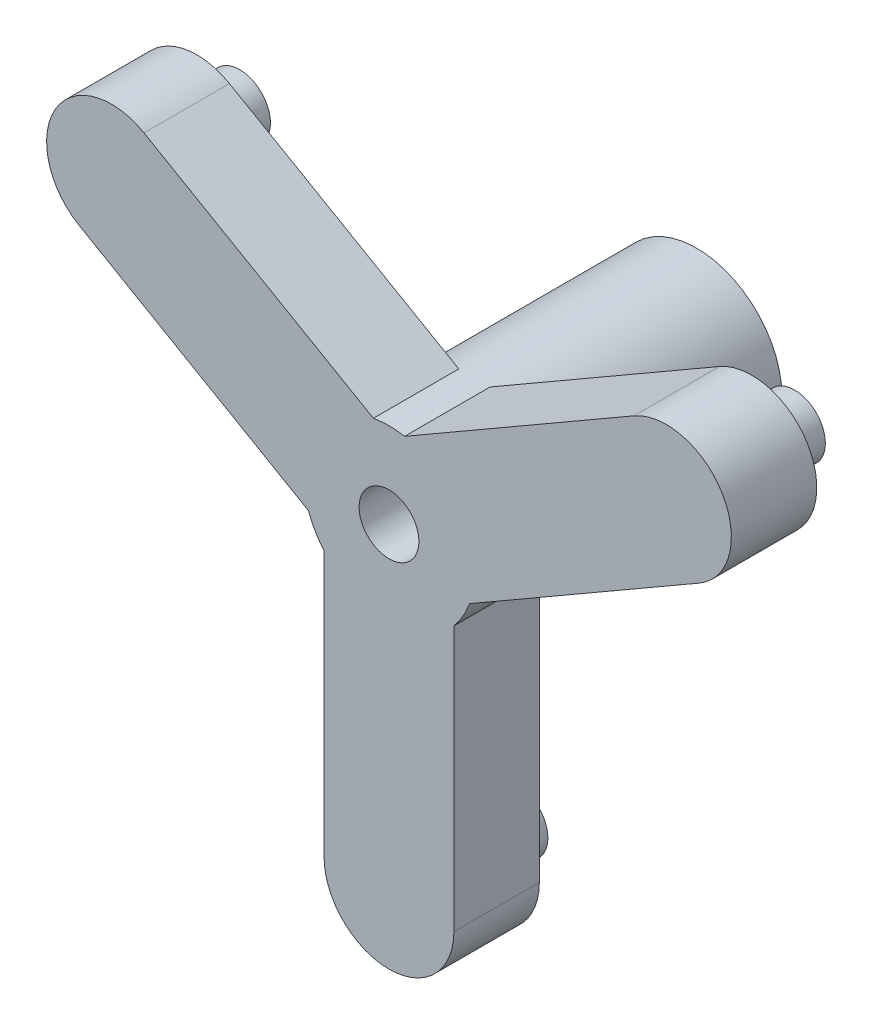
ISO-10303-21;
HEADER;
FILE_DESCRIPTION(('STEP AP214'),'2;1');
FILE_NAME('part.step','',(''),(''),'','','');
FILE_SCHEMA(('AUTOMOTIVE_DESIGN { 1 0 10303 214 1 1 1 1 }'));
ENDSEC;
DATA;
#1=APPLICATION_CONTEXT('core data for automotive mechanical design processes');
#2=APPLICATION_PROTOCOL_DEFINITION('international standard','automotive_design',2000,#1);
#3=PRODUCT_CONTEXT('',#1,'mechanical');
#4=PRODUCT('Part','Part','',(#3));
#5=PRODUCT_RELATED_PRODUCT_CATEGORY('part','',(#4));
#6=PRODUCT_DEFINITION_FORMATION('','',#4);
#7=PRODUCT_DEFINITION_CONTEXT('part definition',#1,'design');
#8=PRODUCT_DEFINITION('design','',#6,#7);
#9=PRODUCT_DEFINITION_SHAPE('','',#8);
#10=(LENGTH_UNIT() NAMED_UNIT(*) SI_UNIT(.MILLI.,.METRE.));
#11=(NAMED_UNIT(*) PLANE_ANGLE_UNIT() SI_UNIT($,.RADIAN.));
#12=(NAMED_UNIT(*) SI_UNIT($,.STERADIAN.) SOLID_ANGLE_UNIT());
#13=UNCERTAINTY_MEASURE_WITH_UNIT(LENGTH_MEASURE(1.E-05),#10,'distance_accuracy_value','');
#14=(GEOMETRIC_REPRESENTATION_CONTEXT(3) GLOBAL_UNCERTAINTY_ASSIGNED_CONTEXT((#13)) GLOBAL_UNIT_ASSIGNED_CONTEXT((#10,
#11,#12)) REPRESENTATION_CONTEXT('',''));
#15=CARTESIAN_POINT('',(0.,0.,0.));
#16=DIRECTION('',(0.,0.,1.));
#17=DIRECTION('',(1.,0.,0.));
#18=AXIS2_PLACEMENT_3D('',#15,#16,#17);
#19=CARTESIAN_POINT('',(0.,0.,16.51));
#20=DIRECTION('',(0.,0.,-1.));
#21=DIRECTION('',(-1.,0.,0.));
#22=AXIS2_PLACEMENT_3D('',#19,#20,#21);
#23=CYLINDRICAL_SURFACE('',#22,6.35);
#24=CARTESIAN_POINT('',(0.,0.,16.51));
#25=DIRECTION('',(0.,0.,1.));
#26=DIRECTION('',(1.,0.,0.));
#27=AXIS2_PLACEMENT_3D('',#24,#25,#26);
#28=CIRCLE('',#27,6.35);
#29=CARTESIAN_POINT('',(-1.16109680898544,6.24294435344124,16.51));
#30=VERTEX_POINT('',#29);
#31=CARTESIAN_POINT('',(-5.98709680898546,-2.11593284388615,16.51));
#32=VERTEX_POINT('',#31);
#33=EDGE_CURVE('E220',#30,#32,#28,.T.);
#34=ORIENTED_EDGE('',*,*,#33,.F.);
#35=DIRECTION('',(0.,0.,-1.));
#36=VECTOR('',#35,1.);
#37=CARTESIAN_POINT('',(-1.16109680898544,6.24294435344124,22.86));
#38=LINE('',#37,#36);
#39=CARTESIAN_POINT('',(-1.16109680898544,6.24294435344124,22.86));
#40=VERTEX_POINT('',#39);
#41=EDGE_CURVE('E193',#40,#30,#38,.T.);
#42=ORIENTED_EDGE('',*,*,#41,.F.);
#43=CARTESIAN_POINT('',(0.,0.,22.86));
#44=DIRECTION('',(0.,0.,1.));
#45=DIRECTION('',(1.,0.,0.));
#46=AXIS2_PLACEMENT_3D('',#43,#44,#45);
#47=CIRCLE('',#46,6.35);
#48=CARTESIAN_POINT('',(1.16109680898547,6.24294435344123,22.86));
#49=VERTEX_POINT('',#48);
#50=EDGE_CURVE('E148',#49,#40,#47,.T.);
#51=ORIENTED_EDGE('',*,*,#50,.F.);
#52=DIRECTION('',(0.,0.,-1.));
#53=VECTOR('',#52,1.);
#54=CARTESIAN_POINT('',(1.16109680898547,6.24294435344123,22.86));
#55=LINE('',#54,#53);
#56=CARTESIAN_POINT('',(1.16109680898547,6.24294435344123,16.51));
#57=VERTEX_POINT('',#56);
#58=EDGE_CURVE('E195',#49,#57,#55,.T.);
#59=ORIENTED_EDGE('',*,*,#58,.T.);
#60=CARTESIAN_POINT('',(5.98709680898545,-2.11593284388617,16.51));
#61=VERTEX_POINT('',#60);
#62=EDGE_CURVE('E49',#61,#57,#28,.T.);
#63=ORIENTED_EDGE('',*,*,#62,.F.);
#64=DIRECTION('',(0.,0.,-1.));
#65=VECTOR('',#64,1.);
#66=CARTESIAN_POINT('',(5.98709680898545,-2.11593284388617,22.86));
#67=LINE('',#66,#65);
#68=CARTESIAN_POINT('',(5.98709680898545,-2.11593284388617,22.86));
#69=VERTEX_POINT('',#68);
#70=EDGE_CURVE('E202',#69,#61,#67,.T.);
#71=ORIENTED_EDGE('',*,*,#70,.F.);
#72=CARTESIAN_POINT('',(4.826,-4.12701150955507,22.86));
#73=VERTEX_POINT('',#72);
#74=EDGE_CURVE('E163',#73,#69,#47,.T.);
#75=ORIENTED_EDGE('',*,*,#74,.F.);
#76=DIRECTION('',(0.,0.,-1.));
#77=VECTOR('',#76,1.);
#78=CARTESIAN_POINT('',(4.826,-4.12701150955507,22.86));
#79=LINE('',#78,#77);
#80=CARTESIAN_POINT('',(4.826,-4.12701150955507,16.51));
#81=VERTEX_POINT('',#80);
#82=EDGE_CURVE('E204',#73,#81,#79,.T.);
#83=ORIENTED_EDGE('',*,*,#82,.T.);
#84=CARTESIAN_POINT('',(-4.826,-4.12701150955507,16.51));
#85=VERTEX_POINT('',#84);
#86=EDGE_CURVE('E57',#85,#81,#28,.T.);
#87=ORIENTED_EDGE('',*,*,#86,.F.);
#88=DIRECTION('',(0.,0.,-1.));
#89=VECTOR('',#88,1.);
#90=CARTESIAN_POINT('',(-4.826,-4.12701150955507,22.86));
#91=LINE('',#90,#89);
#92=CARTESIAN_POINT('',(-4.826,-4.12701150955507,22.86));
#93=VERTEX_POINT('',#92);
#94=EDGE_CURVE('E212',#93,#85,#91,.T.);
#95=ORIENTED_EDGE('',*,*,#94,.F.);
#96=CARTESIAN_POINT('',(-5.98709680898546,-2.11593284388615,22.86));
#97=VERTEX_POINT('',#96);
#98=EDGE_CURVE('E160',#97,#93,#47,.T.);
#99=ORIENTED_EDGE('',*,*,#98,.F.);
#100=DIRECTION('',(0.,0.,-1.));
#101=VECTOR('',#100,1.);
#102=CARTESIAN_POINT('',(-5.98709680898546,-2.11593284388615,22.86));
#103=LINE('',#102,#101);
#104=EDGE_CURVE('E215',#97,#32,#103,.T.);
#105=ORIENTED_EDGE('',*,*,#104,.T.);
#106=EDGE_LOOP('',(#34,#42,#51,#59,#63,#71,#75,#83,#87,#95,#99,#105));
#107=FACE_BOUND('',#106,.T.);
#108=CARTESIAN_POINT('',(0.,0.,0.));
#109=DIRECTION('',(0.,0.,1.));
#110=DIRECTION('',(1.,0.,0.));
#111=AXIS2_PLACEMENT_3D('',#108,#109,#110);
#112=CIRCLE('',#111,6.35);
#113=CARTESIAN_POINT('',(6.35,0.,0.));
#114=VERTEX_POINT('',#113);
#115=EDGE_CURVE('E135',#114,#114,#112,.T.);
#116=ORIENTED_EDGE('',*,*,#115,.T.);
#117=EDGE_LOOP('',(#116));
#118=FACE_BOUND('',#117,.T.);
#119=ADVANCED_FACE('F35',(#107,#118),#23,.T.);
#120=CARTESIAN_POINT('',(0.,0.,0.));
#121=DIRECTION('',(0.,0.,1.));
#122=DIRECTION('',(1.,0.,0.));
#123=AXIS2_PLACEMENT_3D('',#120,#121,#122);
#124=PLANE('',#123);
#125=CARTESIAN_POINT('',(0.,0.,0.));
#126=DIRECTION('',(0.,0.,-1.));
#127=DIRECTION('',(-1.,0.,0.));
#128=AXIS2_PLACEMENT_3D('',#125,#126,#127);
#129=CIRCLE('',#128,2.2225);
#130=CARTESIAN_POINT('',(-2.2225,0.,0.));
#131=VERTEX_POINT('',#130);
#132=EDGE_CURVE('E467',#131,#131,#129,.T.);
#133=ORIENTED_EDGE('',*,*,#132,.F.);
#134=EDGE_LOOP('',(#133));
#135=FACE_BOUND('',#134,.T.);
#136=ORIENTED_EDGE('',*,*,#115,.F.);
#137=EDGE_LOOP('',(#136));
#138=FACE_BOUND('',#137,.T.);
#139=ADVANCED_FACE('F274',(#135,#138),#124,.F.);
#140=CARTESIAN_POINT('',(0.,0.,16.51));
#141=DIRECTION('',(0.,0.,1.));
#142=DIRECTION('',(1.,0.,0.));
#143=AXIS2_PLACEMENT_3D('',#140,#141,#142);
#144=PLANE('',#143);
#145=CARTESIAN_POINT('',(-20.6222299276171,11.9062499999998,16.51));
#146=DIRECTION('',(0.,0.,1.));
#147=DIRECTION('',(1.,0.,0.));
#148=AXIS2_PLACEMENT_3D('',#145,#146,#147);
#149=CIRCLE('',#148,2.286);
#150=CARTESIAN_POINT('',(-18.3362299276171,11.9062499999998,16.51));
#151=VERTEX_POINT('',#150);
#152=EDGE_CURVE('E11',#151,#151,#149,.F.);
#153=ORIENTED_EDGE('',*,*,#152,.F.);
#154=EDGE_LOOP('',(#153));
#155=FACE_BOUND('',#154,.T.);
#156=DIRECTION('',(0.866025403784438,-0.5,0.));
#157=VECTOR('',#156,1.);
#158=CARTESIAN_POINT('',(2.413,4.1794385986637,16.51));
#159=LINE('',#158,#157);
#160=CARTESIAN_POINT('',(-18.2092299276169,16.0856885986637,16.51));
#161=VERTEX_POINT('',#160);
#162=EDGE_CURVE('E132',#161,#30,#159,.T.);
#163=ORIENTED_EDGE('',*,*,#162,.T.);
#164=ORIENTED_EDGE('',*,*,#33,.T.);
#165=DIRECTION('',(0.866025403784439,-0.5,0.));
#166=VECTOR('',#165,1.);
#167=CARTESIAN_POINT('',(-2.41299999999999,-4.17943859866369,16.51));
#168=LINE('',#167,#166);
#169=CARTESIAN_POINT('',(-23.0352299276169,7.72681140133631,16.51));
#170=VERTEX_POINT('',#169);
#171=EDGE_CURVE('E180',#170,#32,#168,.T.);
#172=ORIENTED_EDGE('',*,*,#171,.F.);
#173=CARTESIAN_POINT('',(-20.6222299276169,11.90625,16.51));
#174=DIRECTION('',(0.,0.,1.));
#175=DIRECTION('',(1.,0.,0.));
#176=AXIS2_PLACEMENT_3D('',#173,#174,#175);
#177=CIRCLE('',#176,4.826);
#178=EDGE_CURVE('E178',#161,#170,#177,.T.);
#179=ORIENTED_EDGE('',*,*,#178,.F.);
#180=EDGE_LOOP('',(#163,#164,#172,#179));
#181=FACE_BOUND('',#180,.T.);
#182=ADVANCED_FACE('F235',(#155,#181),#144,.F.);
#183=CARTESIAN_POINT('',(0.,-23.8125,16.51));
#184=DIRECTION('',(0.,0.,1.));
#185=DIRECTION('',(1.,0.,0.));
#186=AXIS2_PLACEMENT_3D('',#183,#184,#185);
#187=CIRCLE('',#186,2.286);
#188=CARTESIAN_POINT('',(2.286,-23.8125,16.51));
#189=VERTEX_POINT('',#188);
#190=EDGE_CURVE('E223',#189,#189,#187,.F.);
#191=ORIENTED_EDGE('',*,*,#190,.F.);
#192=EDGE_LOOP('',(#191));
#193=FACE_BOUND('',#192,.T.);
#194=DIRECTION('',(0.,1.,0.));
#195=VECTOR('',#194,1.);
#196=CARTESIAN_POINT('',(-4.826,0.,16.51));
#197=LINE('',#196,#195);
#198=CARTESIAN_POINT('',(-4.826,-23.8125,16.51));
#199=VERTEX_POINT('',#198);
#200=EDGE_CURVE('E183',#199,#85,#197,.T.);
#201=ORIENTED_EDGE('',*,*,#200,.T.);
#202=ORIENTED_EDGE('',*,*,#86,.T.);
#203=DIRECTION('',(0.,1.,0.));
#204=VECTOR('',#203,1.);
#205=CARTESIAN_POINT('',(4.826,0.,16.51));
#206=LINE('',#205,#204);
#207=CARTESIAN_POINT('',(4.826,-23.8125,16.51));
#208=VERTEX_POINT('',#207);
#209=EDGE_CURVE('E187',#208,#81,#206,.T.);
#210=ORIENTED_EDGE('',*,*,#209,.F.);
#211=CARTESIAN_POINT('',(0.,-23.8125,16.51));
#212=DIRECTION('',(0.,0.,1.));
#213=DIRECTION('',(1.,0.,0.));
#214=AXIS2_PLACEMENT_3D('',#211,#212,#213);
#215=CIRCLE('',#214,4.826);
#216=EDGE_CURVE('E185',#199,#208,#215,.T.);
#217=ORIENTED_EDGE('',*,*,#216,.F.);
#218=EDGE_LOOP('',(#201,#202,#210,#217));
#219=FACE_BOUND('',#218,.T.);
#220=ADVANCED_FACE('F233',(#193,#219),#144,.F.);
#221=CARTESIAN_POINT('',(20.6222299276169,11.9062500000001,16.51));
#222=DIRECTION('',(0.,0.,1.));
#223=DIRECTION('',(1.,0.,0.));
#224=AXIS2_PLACEMENT_3D('',#221,#222,#223);
#225=CIRCLE('',#224,2.286);
#226=CARTESIAN_POINT('',(22.9082299276169,11.9062500000001,16.51));
#227=VERTEX_POINT('',#226);
#228=EDGE_CURVE('E42',#227,#227,#225,.F.);
#229=ORIENTED_EDGE('',*,*,#228,.F.);
#230=EDGE_LOOP('',(#229));
#231=FACE_BOUND('',#230,.T.);
#232=DIRECTION('',(-0.866025403784439,-0.5,0.));
#233=VECTOR('',#232,1.);
#234=CARTESIAN_POINT('',(2.413,-4.1794385986637,16.51));
#235=LINE('',#234,#233);
#236=CARTESIAN_POINT('',(23.035229927617,7.7268114013363,16.51));
#237=VERTEX_POINT('',#236);
#238=EDGE_CURVE('E189',#237,#61,#235,.T.);
#239=ORIENTED_EDGE('',*,*,#238,.T.);
#240=ORIENTED_EDGE('',*,*,#62,.T.);
#241=DIRECTION('',(-0.866025403784438,-0.5,0.));
#242=VECTOR('',#241,1.);
#243=CARTESIAN_POINT('',(-2.41299999999999,4.17943859866369,16.51));
#244=LINE('',#243,#242);
#245=CARTESIAN_POINT('',(18.209229927617,16.0856885986637,16.51));
#246=VERTEX_POINT('',#245);
#247=EDGE_CURVE('E150',#246,#57,#244,.T.);
#248=ORIENTED_EDGE('',*,*,#247,.F.);
#249=CARTESIAN_POINT('',(20.6222299276169,11.90625,16.51));
#250=DIRECTION('',(0.,0.,1.));
#251=DIRECTION('',(1.,0.,0.));
#252=AXIS2_PLACEMENT_3D('',#249,#250,#251);
#253=CIRCLE('',#252,4.826);
#254=EDGE_CURVE('E153',#237,#246,#253,.T.);
#255=ORIENTED_EDGE('',*,*,#254,.F.);
#256=EDGE_LOOP('',(#239,#240,#248,#255));
#257=FACE_BOUND('',#256,.T.);
#258=ADVANCED_FACE('F230',(#231,#257),#144,.F.);
#259=CARTESIAN_POINT('',(2.413,4.1794385986637,22.86));
#260=DIRECTION('',(0.5,0.866025403784438,0.));
#261=DIRECTION('',(-0.866025403784438,0.5,0.));
#262=AXIS2_PLACEMENT_3D('',#259,#260,#261);
#263=PLANE('',#262);
#264=ORIENTED_EDGE('',*,*,#162,.F.);
#265=DIRECTION('',(0.,0.,-1.));
#266=VECTOR('',#265,1.);
#267=CARTESIAN_POINT('',(-18.2092299276169,16.0856885986637,22.86));
#268=LINE('',#267,#266);
#269=CARTESIAN_POINT('',(-18.2092299276169,16.0856885986637,22.86));
#270=VERTEX_POINT('',#269);
#271=EDGE_CURVE('E125',#270,#161,#268,.T.);
#272=ORIENTED_EDGE('',*,*,#271,.F.);
#273=DIRECTION('',(0.866025403784438,-0.5,0.));
#274=VECTOR('',#273,1.);
#275=CARTESIAN_POINT('',(2.413,4.1794385986637,22.86));
#276=LINE('',#275,#274);
#277=EDGE_CURVE('E130',#270,#40,#276,.T.);
#278=ORIENTED_EDGE('',*,*,#277,.T.);
#279=ORIENTED_EDGE('',*,*,#41,.T.);
#280=EDGE_LOOP('',(#264,#272,#278,#279));
#281=FACE_BOUND('',#280,.T.);
#282=ADVANCED_FACE('F127',(#281),#263,.T.);
#283=CARTESIAN_POINT('',(-20.6222299276169,11.90625,22.86));
#284=DIRECTION('',(0.,0.,-1.));
#285=DIRECTION('',(-1.,0.,0.));
#286=AXIS2_PLACEMENT_3D('',#283,#284,#285);
#287=CYLINDRICAL_SURFACE('',#286,4.826);
#288=ORIENTED_EDGE('',*,*,#178,.T.);
#289=DIRECTION('',(0.,0.,-1.));
#290=VECTOR('',#289,1.);
#291=CARTESIAN_POINT('',(-23.0352299276169,7.72681140133631,22.86));
#292=LINE('',#291,#290);
#293=CARTESIAN_POINT('',(-23.0352299276169,7.72681140133631,22.86));
#294=VERTEX_POINT('',#293);
#295=EDGE_CURVE('E136',#294,#170,#292,.T.);
#296=ORIENTED_EDGE('',*,*,#295,.F.);
#297=CARTESIAN_POINT('',(-20.6222299276169,11.90625,22.86));
#298=DIRECTION('',(0.,0.,1.));
#299=DIRECTION('',(1.,0.,0.));
#300=AXIS2_PLACEMENT_3D('',#297,#298,#299);
#301=CIRCLE('',#300,4.826);
#302=EDGE_CURVE('E139',#270,#294,#301,.T.);
#303=ORIENTED_EDGE('',*,*,#302,.F.);
#304=ORIENTED_EDGE('',*,*,#271,.T.);
#305=EDGE_LOOP('',(#288,#296,#303,#304));
#306=FACE_BOUND('',#305,.T.);
#307=ADVANCED_FACE('F140',(#306),#287,.T.);
#308=CARTESIAN_POINT('',(-2.41299999999999,-4.17943859866369,22.86));
#309=DIRECTION('',(0.5,0.866025403784439,0.));
#310=DIRECTION('',(-0.866025403784439,0.5,0.));
#311=AXIS2_PLACEMENT_3D('',#308,#309,#310);
#312=PLANE('',#311);
#313=ORIENTED_EDGE('',*,*,#171,.T.);
#314=ORIENTED_EDGE('',*,*,#104,.F.);
#315=DIRECTION('',(0.866025403784439,-0.5,0.));
#316=VECTOR('',#315,1.);
#317=CARTESIAN_POINT('',(-2.41299999999999,-4.17943859866369,22.86));
#318=LINE('',#317,#316);
#319=EDGE_CURVE('E144',#294,#97,#318,.T.);
#320=ORIENTED_EDGE('',*,*,#319,.F.);
#321=ORIENTED_EDGE('',*,*,#295,.T.);
#322=EDGE_LOOP('',(#313,#314,#320,#321));
#323=FACE_BOUND('',#322,.T.);
#324=ADVANCED_FACE('F263',(#323),#312,.F.);
#325=CARTESIAN_POINT('',(-4.826,0.,22.86));
#326=DIRECTION('',(-1.,0.,0.));
#327=DIRECTION('',(0.,-1.,0.));
#328=AXIS2_PLACEMENT_3D('',#325,#326,#327);
#329=PLANE('',#328);
#330=ORIENTED_EDGE('',*,*,#200,.F.);
#331=DIRECTION('',(0.,0.,-1.));
#332=VECTOR('',#331,1.);
#333=CARTESIAN_POINT('',(-4.826,-23.8125,22.86));
#334=LINE('',#333,#332);
#335=CARTESIAN_POINT('',(-4.826,-23.8125,22.86));
#336=VERTEX_POINT('',#335);
#337=EDGE_CURVE('E210',#336,#199,#334,.T.);
#338=ORIENTED_EDGE('',*,*,#337,.F.);
#339=DIRECTION('',(0.,1.,0.));
#340=VECTOR('',#339,1.);
#341=CARTESIAN_POINT('',(-4.826,0.,22.86));
#342=LINE('',#341,#340);
#343=EDGE_CURVE('E162',#336,#93,#342,.T.);
#344=ORIENTED_EDGE('',*,*,#343,.T.);
#345=ORIENTED_EDGE('',*,*,#94,.T.);
#346=EDGE_LOOP('',(#330,#338,#344,#345));
#347=FACE_BOUND('',#346,.T.);
#348=ADVANCED_FACE('F256',(#347),#329,.T.);
#349=CARTESIAN_POINT('',(0.,-23.8125,22.86));
#350=DIRECTION('',(0.,0.,-1.));
#351=DIRECTION('',(-1.,0.,0.));
#352=AXIS2_PLACEMENT_3D('',#349,#350,#351);
#353=CYLINDRICAL_SURFACE('',#352,4.826);
#354=ORIENTED_EDGE('',*,*,#216,.T.);
#355=DIRECTION('',(0.,0.,-1.));
#356=VECTOR('',#355,1.);
#357=CARTESIAN_POINT('',(4.826,-23.8125,22.86));
#358=LINE('',#357,#356);
#359=CARTESIAN_POINT('',(4.826,-23.8125,22.86));
#360=VERTEX_POINT('',#359);
#361=EDGE_CURVE('E207',#360,#208,#358,.T.);
#362=ORIENTED_EDGE('',*,*,#361,.F.);
#363=CARTESIAN_POINT('',(0.,-23.8125,22.86));
#364=DIRECTION('',(0.,0.,1.));
#365=DIRECTION('',(1.,0.,0.));
#366=AXIS2_PLACEMENT_3D('',#363,#364,#365);
#367=CIRCLE('',#366,4.826);
#368=EDGE_CURVE('E166',#336,#360,#367,.T.);
#369=ORIENTED_EDGE('',*,*,#368,.F.);
#370=ORIENTED_EDGE('',*,*,#337,.T.);
#371=EDGE_LOOP('',(#354,#362,#369,#370));
#372=FACE_BOUND('',#371,.T.);
#373=ADVANCED_FACE('F270',(#372),#353,.T.);
#374=CARTESIAN_POINT('',(4.826,0.,22.86));
#375=DIRECTION('',(-1.,0.,0.));
#376=DIRECTION('',(0.,-1.,0.));
#377=AXIS2_PLACEMENT_3D('',#374,#375,#376);
#378=PLANE('',#377);
#379=ORIENTED_EDGE('',*,*,#209,.T.);
#380=ORIENTED_EDGE('',*,*,#82,.F.);
#381=DIRECTION('',(0.,1.,0.));
#382=VECTOR('',#381,1.);
#383=CARTESIAN_POINT('',(4.826,0.,22.86));
#384=LINE('',#383,#382);
#385=EDGE_CURVE('E168',#360,#73,#384,.T.);
#386=ORIENTED_EDGE('',*,*,#385,.F.);
#387=ORIENTED_EDGE('',*,*,#361,.T.);
#388=EDGE_LOOP('',(#379,#380,#386,#387));
#389=FACE_BOUND('',#388,.T.);
#390=ADVANCED_FACE('F251',(#389),#378,.F.);
#391=CARTESIAN_POINT('',(2.413,-4.1794385986637,22.86));
#392=DIRECTION('',(0.5,-0.866025403784439,0.));
#393=DIRECTION('',(0.866025403784439,0.5,0.));
#394=AXIS2_PLACEMENT_3D('',#391,#392,#393);
#395=PLANE('',#394);
#396=ORIENTED_EDGE('',*,*,#238,.F.);
#397=DIRECTION('',(0.,0.,-1.));
#398=VECTOR('',#397,1.);
#399=CARTESIAN_POINT('',(23.035229927617,7.7268114013363,22.86));
#400=LINE('',#399,#398);
#401=CARTESIAN_POINT('',(23.035229927617,7.7268114013363,22.86));
#402=VERTEX_POINT('',#401);
#403=EDGE_CURVE('E200',#402,#237,#400,.T.);
#404=ORIENTED_EDGE('',*,*,#403,.F.);
#405=DIRECTION('',(-0.866025403784439,-0.5,0.));
#406=VECTOR('',#405,1.);
#407=CARTESIAN_POINT('',(2.413,-4.1794385986637,22.86));
#408=LINE('',#407,#406);
#409=EDGE_CURVE('E170',#402,#69,#408,.T.);
#410=ORIENTED_EDGE('',*,*,#409,.T.);
#411=ORIENTED_EDGE('',*,*,#70,.T.);
#412=EDGE_LOOP('',(#396,#404,#410,#411));
#413=FACE_BOUND('',#412,.T.);
#414=ADVANCED_FACE('F240',(#413),#395,.T.);
#415=CARTESIAN_POINT('',(20.6222299276169,11.90625,22.86));
#416=DIRECTION('',(0.,0.,-1.));
#417=DIRECTION('',(-1.,0.,0.));
#418=AXIS2_PLACEMENT_3D('',#415,#416,#417);
#419=CYLINDRICAL_SURFACE('',#418,4.826);
#420=ORIENTED_EDGE('',*,*,#254,.T.);
#421=DIRECTION('',(0.,0.,-1.));
#422=VECTOR('',#421,1.);
#423=CARTESIAN_POINT('',(18.209229927617,16.0856885986637,22.86));
#424=LINE('',#423,#422);
#425=CARTESIAN_POINT('',(18.209229927617,16.0856885986637,22.86));
#426=VERTEX_POINT('',#425);
#427=EDGE_CURVE('E197',#426,#246,#424,.T.);
#428=ORIENTED_EDGE('',*,*,#427,.F.);
#429=CARTESIAN_POINT('',(20.6222299276169,11.90625,22.86));
#430=DIRECTION('',(0.,0.,1.));
#431=DIRECTION('',(1.,0.,0.));
#432=AXIS2_PLACEMENT_3D('',#429,#430,#431);
#433=CIRCLE('',#432,4.826);
#434=EDGE_CURVE('E173',#402,#426,#433,.T.);
#435=ORIENTED_EDGE('',*,*,#434,.F.);
#436=ORIENTED_EDGE('',*,*,#403,.T.);
#437=EDGE_LOOP('',(#420,#428,#435,#436));
#438=FACE_BOUND('',#437,.T.);
#439=ADVANCED_FACE('F331',(#438),#419,.T.);
#440=CARTESIAN_POINT('',(-2.41299999999999,4.17943859866369,22.86));
#441=DIRECTION('',(0.5,-0.866025403784438,0.));
#442=DIRECTION('',(0.866025403784438,0.5,0.));
#443=AXIS2_PLACEMENT_3D('',#440,#441,#442);
#444=PLANE('',#443);
#445=ORIENTED_EDGE('',*,*,#247,.T.);
#446=ORIENTED_EDGE('',*,*,#58,.F.);
#447=DIRECTION('',(-0.866025403784438,-0.5,0.));
#448=VECTOR('',#447,1.);
#449=CARTESIAN_POINT('',(-2.41299999999999,4.17943859866369,22.86));
#450=LINE('',#449,#448);
#451=EDGE_CURVE('E175',#426,#49,#450,.T.);
#452=ORIENTED_EDGE('',*,*,#451,.F.);
#453=ORIENTED_EDGE('',*,*,#427,.T.);
#454=EDGE_LOOP('',(#445,#446,#452,#453));
#455=FACE_BOUND('',#454,.T.);
#456=ADVANCED_FACE('F340',(#455),#444,.F.);
#457=CARTESIAN_POINT('',(0.,0.,22.86));
#458=DIRECTION('',(0.,0.,1.));
#459=DIRECTION('',(1.,0.,0.));
#460=AXIS2_PLACEMENT_3D('',#457,#458,#459);
#461=PLANE('',#460);
#462=CARTESIAN_POINT('',(0.,0.,22.86));
#463=DIRECTION('',(0.,0.,-1.));
#464=DIRECTION('',(-1.,0.,0.));
#465=AXIS2_PLACEMENT_3D('',#462,#463,#464);
#466=CIRCLE('',#465,2.2225);
#467=CARTESIAN_POINT('',(-2.2225,0.,22.86));
#468=VERTEX_POINT('',#467);
#469=EDGE_CURVE('E465',#468,#468,#466,.T.);
#470=ORIENTED_EDGE('',*,*,#469,.T.);
#471=EDGE_LOOP('',(#470));
#472=FACE_BOUND('',#471,.T.);
#473=ORIENTED_EDGE('',*,*,#277,.F.);
#474=ORIENTED_EDGE('',*,*,#302,.T.);
#475=ORIENTED_EDGE('',*,*,#319,.T.);
#476=ORIENTED_EDGE('',*,*,#98,.T.);
#477=ORIENTED_EDGE('',*,*,#343,.F.);
#478=ORIENTED_EDGE('',*,*,#368,.T.);
#479=ORIENTED_EDGE('',*,*,#385,.T.);
#480=ORIENTED_EDGE('',*,*,#74,.T.);
#481=ORIENTED_EDGE('',*,*,#409,.F.);
#482=ORIENTED_EDGE('',*,*,#434,.T.);
#483=ORIENTED_EDGE('',*,*,#451,.T.);
#484=ORIENTED_EDGE('',*,*,#50,.T.);
#485=EDGE_LOOP('',(#473,#474,#475,#476,#477,#478,#479,#480,#481,#482,#483,#484));
#486=FACE_BOUND('',#485,.T.);
#487=ADVANCED_FACE('F146',(#472,#486),#461,.T.);
#488=CARTESIAN_POINT('',(0.,-23.8125,13.335));
#489=DIRECTION('',(0.,0.,1.));
#490=DIRECTION('',(1.,0.,0.));
#491=AXIS2_PLACEMENT_3D('',#488,#489,#490);
#492=CYLINDRICAL_SURFACE('',#491,2.286);
#493=CARTESIAN_POINT('',(0.,-23.8125,13.335));
#494=DIRECTION('',(0.,0.,-1.));
#495=DIRECTION('',(-1.,0.,0.));
#496=AXIS2_PLACEMENT_3D('',#493,#494,#495);
#497=CIRCLE('',#496,2.286);
#498=CARTESIAN_POINT('',(-2.286,-23.8125,13.335));
#499=VERTEX_POINT('',#498);
#500=EDGE_CURVE('E156',#499,#499,#497,.T.);
#501=ORIENTED_EDGE('',*,*,#500,.F.);
#502=EDGE_LOOP('',(#501));
#503=FACE_BOUND('',#502,.T.);
#504=ORIENTED_EDGE('',*,*,#190,.T.);
#505=EDGE_LOOP('',(#504));
#506=FACE_BOUND('',#505,.T.);
#507=ADVANCED_FACE('F379',(#503,#506),#492,.T.);
#508=CARTESIAN_POINT('',(0.,-23.8125,13.335));
#509=DIRECTION('',(0.,0.,-1.));
#510=DIRECTION('',(-1.,0.,0.));
#511=AXIS2_PLACEMENT_3D('',#508,#509,#510);
#512=PLANE('',#511);
#513=ORIENTED_EDGE('',*,*,#500,.T.);
#514=EDGE_LOOP('',(#513));
#515=FACE_BOUND('',#514,.T.);
#516=ADVANCED_FACE('F384',(#515),#512,.T.);
#517=CARTESIAN_POINT('',(20.6222299276169,11.9062500000001,13.335));
#518=DIRECTION('',(0.,0.,1.));
#519=DIRECTION('',(1.,0.,0.));
#520=AXIS2_PLACEMENT_3D('',#517,#518,#519);
#521=CYLINDRICAL_SURFACE('',#520,2.286);
#522=CARTESIAN_POINT('',(20.6222299276169,11.9062500000001,13.335));
#523=DIRECTION('',(0.,0.,-1.));
#524=DIRECTION('',(-1.,0.,0.));
#525=AXIS2_PLACEMENT_3D('',#522,#523,#524);
#526=CIRCLE('',#525,2.286);
#527=CARTESIAN_POINT('',(18.3362299276169,11.9062500000001,13.335));
#528=VERTEX_POINT('',#527);
#529=EDGE_CURVE('E473',#528,#528,#526,.T.);
#530=ORIENTED_EDGE('',*,*,#529,.F.);
#531=EDGE_LOOP('',(#530));
#532=FACE_BOUND('',#531,.T.);
#533=ORIENTED_EDGE('',*,*,#228,.T.);
#534=EDGE_LOOP('',(#533));
#535=FACE_BOUND('',#534,.T.);
#536=ADVANCED_FACE('F228',(#532,#535),#521,.T.);
#537=CARTESIAN_POINT('',(20.6222299276169,11.9062500000001,13.335));
#538=DIRECTION('',(0.,0.,-1.));
#539=DIRECTION('',(-1.,0.,0.));
#540=AXIS2_PLACEMENT_3D('',#537,#538,#539);
#541=PLANE('',#540);
#542=ORIENTED_EDGE('',*,*,#529,.T.);
#543=EDGE_LOOP('',(#542));
#544=FACE_BOUND('',#543,.T.);
#545=ADVANCED_FACE('F404',(#544),#541,.T.);
#546=CARTESIAN_POINT('',(-20.6222299276171,11.9062499999998,13.335));
#547=DIRECTION('',(0.,0.,1.));
#548=DIRECTION('',(1.,0.,0.));
#549=AXIS2_PLACEMENT_3D('',#546,#547,#548);
#550=CYLINDRICAL_SURFACE('',#549,2.286);
#551=CARTESIAN_POINT('',(-20.6222299276171,11.9062499999998,13.335));
#552=DIRECTION('',(0.,0.,-1.));
#553=DIRECTION('',(-1.,0.,0.));
#554=AXIS2_PLACEMENT_3D('',#551,#552,#553);
#555=CIRCLE('',#554,2.286);
#556=CARTESIAN_POINT('',(-22.9082299276171,11.9062499999998,13.335));
#557=VERTEX_POINT('',#556);
#558=EDGE_CURVE('E469',#557,#557,#555,.T.);
#559=ORIENTED_EDGE('',*,*,#558,.F.);
#560=EDGE_LOOP('',(#559));
#561=FACE_BOUND('',#560,.T.);
#562=ORIENTED_EDGE('',*,*,#152,.T.);
#563=EDGE_LOOP('',(#562));
#564=FACE_BOUND('',#563,.T.);
#565=ADVANCED_FACE('F414',(#561,#564),#550,.T.);
#566=CARTESIAN_POINT('',(-20.6222299276171,11.9062499999998,13.335));
#567=DIRECTION('',(0.,0.,-1.));
#568=DIRECTION('',(-1.,0.,0.));
#569=AXIS2_PLACEMENT_3D('',#566,#567,#568);
#570=PLANE('',#569);
#571=ORIENTED_EDGE('',*,*,#558,.T.);
#572=EDGE_LOOP('',(#571));
#573=FACE_BOUND('',#572,.T.);
#574=ADVANCED_FACE('F424',(#573),#570,.T.);
#575=CARTESIAN_POINT('',(0.,0.,22.86));
#576=DIRECTION('',(0.,0.,-1.));
#577=DIRECTION('',(-1.,0.,0.));
#578=AXIS2_PLACEMENT_3D('',#575,#576,#577);
#579=CYLINDRICAL_SURFACE('',#578,2.2225);
#580=ORIENTED_EDGE('',*,*,#469,.F.);
#581=EDGE_LOOP('',(#580));
#582=FACE_BOUND('',#581,.T.);
#583=ORIENTED_EDGE('',*,*,#132,.T.);
#584=EDGE_LOOP('',(#583));
#585=FACE_BOUND('',#584,.T.);
#586=ADVANCED_FACE('F433',(#582,#585),#579,.F.);
#587=CLOSED_SHELL('',(#119,#139,#182,#220,#258,#282,#307,#324,#348,#373,#390,#414,#439,#456,
#487,#507,#516,#536,#545,#565,#574,#586));
#588=MANIFOLD_SOLID_BREP('B2',#587);
#589=ADVANCED_BREP_SHAPE_REPRESENTATION('',(#18,#588),#14);
#590=SHAPE_DEFINITION_REPRESENTATION(#9,#589);
ENDSEC;
END-ISO-10303-21;
